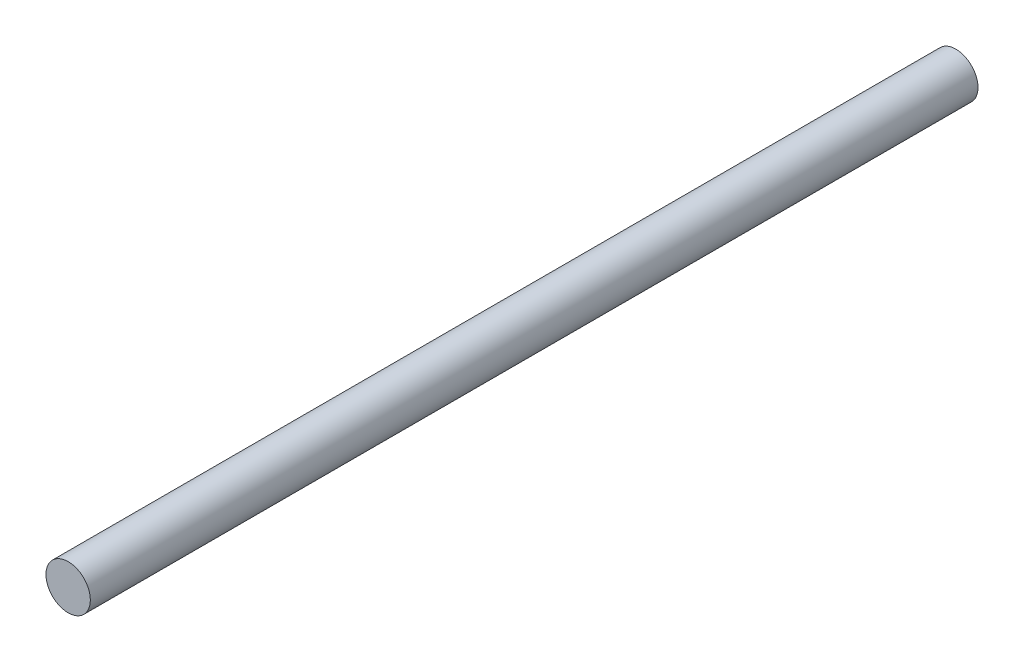
ISO-10303-21;
HEADER;
FILE_DESCRIPTION(('STEP AP214'),'2;1');
FILE_NAME('part.step','',(''),(''),'','','');
FILE_SCHEMA(('AUTOMOTIVE_DESIGN { 1 0 10303 214 1 1 1 1 }'));
ENDSEC;
DATA;
#1=APPLICATION_CONTEXT('core data for automotive mechanical design processes');
#2=APPLICATION_PROTOCOL_DEFINITION('international standard','automotive_design',2000,#1);
#3=PRODUCT_CONTEXT('',#1,'mechanical');
#4=PRODUCT('Part','Part','',(#3));
#5=PRODUCT_RELATED_PRODUCT_CATEGORY('part','',(#4));
#6=PRODUCT_DEFINITION_FORMATION('','',#4);
#7=PRODUCT_DEFINITION_CONTEXT('part definition',#1,'design');
#8=PRODUCT_DEFINITION('design','',#6,#7);
#9=PRODUCT_DEFINITION_SHAPE('','',#8);
#10=(LENGTH_UNIT() NAMED_UNIT(*) SI_UNIT(.MILLI.,.METRE.));
#11=(NAMED_UNIT(*) PLANE_ANGLE_UNIT() SI_UNIT($,.RADIAN.));
#12=(NAMED_UNIT(*) SI_UNIT($,.STERADIAN.) SOLID_ANGLE_UNIT());
#13=UNCERTAINTY_MEASURE_WITH_UNIT(LENGTH_MEASURE(1.E-05),#10,'distance_accuracy_value','');
#14=(GEOMETRIC_REPRESENTATION_CONTEXT(3) GLOBAL_UNCERTAINTY_ASSIGNED_CONTEXT((#13)) GLOBAL_UNIT_ASSIGNED_CONTEXT((#10,
#11,#12)) REPRESENTATION_CONTEXT('',''));
#15=CARTESIAN_POINT('',(0.,0.,0.));
#16=DIRECTION('',(0.,0.,1.));
#17=DIRECTION('',(1.,0.,0.));
#18=AXIS2_PLACEMENT_3D('',#15,#16,#17);
#19=CARTESIAN_POINT('',(0.,0.,30.));
#20=DIRECTION('',(0.,0.,-1.));
#21=DIRECTION('',(-1.,0.,0.));
#22=AXIS2_PLACEMENT_3D('',#19,#20,#21);
#23=CYLINDRICAL_SURFACE('',#22,0.75);
#24=CARTESIAN_POINT('',(0.,0.,30.));
#25=DIRECTION('',(0.,0.,1.));
#26=DIRECTION('',(1.,0.,0.));
#27=AXIS2_PLACEMENT_3D('',#24,#25,#26);
#28=CIRCLE('',#27,0.75);
#29=CARTESIAN_POINT('',(0.75,0.,30.));
#30=VERTEX_POINT('',#29);
#31=EDGE_CURVE('E10',#30,#30,#28,.T.);
#32=ORIENTED_EDGE('',*,*,#31,.F.);
#33=EDGE_LOOP('',(#32));
#34=FACE_BOUND('',#33,.T.);
#35=CARTESIAN_POINT('',(0.,0.,0.));
#36=DIRECTION('',(0.,0.,1.));
#37=DIRECTION('',(1.,0.,0.));
#38=AXIS2_PLACEMENT_3D('',#35,#36,#37);
#39=CIRCLE('',#38,0.75);
#40=CARTESIAN_POINT('',(0.75,0.,0.));
#41=VERTEX_POINT('',#40);
#42=EDGE_CURVE('E40',#41,#41,#39,.T.);
#43=ORIENTED_EDGE('',*,*,#42,.T.);
#44=EDGE_LOOP('',(#43));
#45=FACE_BOUND('',#44,.T.);
#46=ADVANCED_FACE('F37',(#34,#45),#23,.T.);
#47=CARTESIAN_POINT('',(0.,0.,30.));
#48=DIRECTION('',(0.,0.,1.));
#49=DIRECTION('',(1.,0.,0.));
#50=AXIS2_PLACEMENT_3D('',#47,#48,#49);
#51=PLANE('',#50);
#52=ORIENTED_EDGE('',*,*,#31,.T.);
#53=EDGE_LOOP('',(#52));
#54=FACE_BOUND('',#53,.T.);
#55=ADVANCED_FACE('F54',(#54),#51,.T.);
#56=CARTESIAN_POINT('',(0.,0.,0.));
#57=DIRECTION('',(0.,0.,1.));
#58=DIRECTION('',(1.,0.,0.));
#59=AXIS2_PLACEMENT_3D('',#56,#57,#58);
#60=PLANE('',#59);
#61=ORIENTED_EDGE('',*,*,#42,.F.);
#62=EDGE_LOOP('',(#61));
#63=FACE_BOUND('',#62,.T.);
#64=ADVANCED_FACE('F52',(#63),#60,.F.);
#65=CLOSED_SHELL('',(#46,#55,#64));
#66=MANIFOLD_SOLID_BREP('B2',#65);
#67=ADVANCED_BREP_SHAPE_REPRESENTATION('',(#18,#66),#14);
#68=SHAPE_DEFINITION_REPRESENTATION(#9,#67);
ENDSEC;
END-ISO-10303-21;
